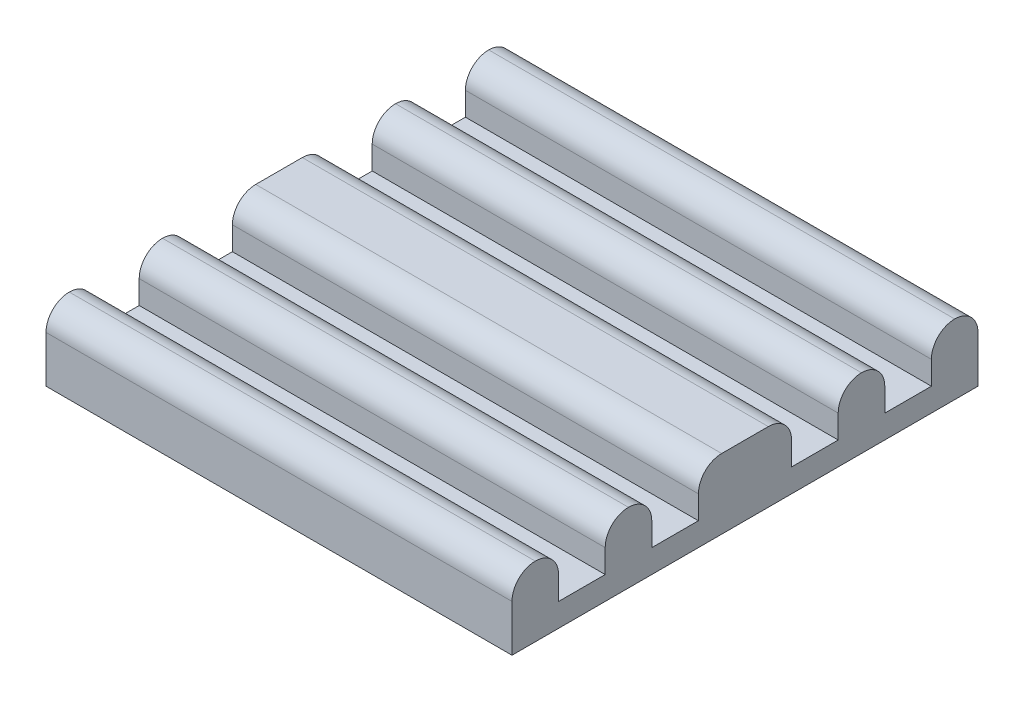
ISO-10303-21;
HEADER;
FILE_DESCRIPTION(('STEP AP214'),'2;1');
FILE_NAME('part.step','',(''),(''),'','','');
FILE_SCHEMA(('AUTOMOTIVE_DESIGN { 1 0 10303 214 1 1 1 1 }'));
ENDSEC;
DATA;
#1=APPLICATION_CONTEXT('core data for automotive mechanical design processes');
#2=APPLICATION_PROTOCOL_DEFINITION('international standard','automotive_design',2000,#1);
#3=PRODUCT_CONTEXT('',#1,'mechanical');
#4=PRODUCT('Part','Part','',(#3));
#5=PRODUCT_RELATED_PRODUCT_CATEGORY('part','',(#4));
#6=PRODUCT_DEFINITION_FORMATION('','',#4);
#7=PRODUCT_DEFINITION_CONTEXT('part definition',#1,'design');
#8=PRODUCT_DEFINITION('design','',#6,#7);
#9=PRODUCT_DEFINITION_SHAPE('','',#8);
#10=(LENGTH_UNIT() NAMED_UNIT(*) SI_UNIT(.MILLI.,.METRE.));
#11=(NAMED_UNIT(*) PLANE_ANGLE_UNIT() SI_UNIT($,.RADIAN.));
#12=(NAMED_UNIT(*) SI_UNIT($,.STERADIAN.) SOLID_ANGLE_UNIT());
#13=UNCERTAINTY_MEASURE_WITH_UNIT(LENGTH_MEASURE(1.E-05),#10,'distance_accuracy_value','');
#14=(GEOMETRIC_REPRESENTATION_CONTEXT(3) GLOBAL_UNCERTAINTY_ASSIGNED_CONTEXT((#13)) GLOBAL_UNIT_ASSIGNED_CONTEXT((#10,
#11,#12)) REPRESENTATION_CONTEXT('',''));
#15=CARTESIAN_POINT('',(0.,0.,0.));
#16=DIRECTION('',(0.,0.,1.));
#17=DIRECTION('',(1.,0.,0.));
#18=AXIS2_PLACEMENT_3D('',#15,#16,#17);
#19=CARTESIAN_POINT('',(10.,3.,-10.));
#20=DIRECTION('',(-1.,0.,0.));
#21=DIRECTION('',(0.,0.,1.));
#22=AXIS2_PLACEMENT_3D('',#19,#20,#21);
#23=PLANE('',#22);
#24=CARTESIAN_POINT('',(10.,2.,9.));
#25=DIRECTION('',(-1.,0.,0.));
#26=DIRECTION('',(0.,0.,1.));
#27=AXIS2_PLACEMENT_3D('',#24,#25,#26);
#28=CIRCLE('',#27,1.);
#29=CARTESIAN_POINT('',(10.,2.,8.));
#30=VERTEX_POINT('',#29);
#31=CARTESIAN_POINT('',(10.,3.,9.));
#32=VERTEX_POINT('',#31);
#33=EDGE_CURVE('E413',#30,#32,#28,.F.);
#34=ORIENTED_EDGE('',*,*,#33,.T.);
#35=CARTESIAN_POINT('',(10.,2.,9.));
#36=DIRECTION('',(-1.,0.,0.));
#37=DIRECTION('',(0.,0.,1.));
#38=AXIS2_PLACEMENT_3D('',#35,#36,#37);
#39=CIRCLE('',#38,1.);
#40=CARTESIAN_POINT('',(10.,2.,10.));
#41=VERTEX_POINT('',#40);
#42=EDGE_CURVE('E416',#32,#41,#39,.F.);
#43=ORIENTED_EDGE('',*,*,#42,.T.);
#44=DIRECTION('',(0.,-1.,0.));
#45=VECTOR('',#44,1.);
#46=CARTESIAN_POINT('',(10.,3.,10.));
#47=LINE('',#46,#45);
#48=CARTESIAN_POINT('',(10.,0.,10.));
#49=VERTEX_POINT('',#48);
#50=EDGE_CURVE('E363',#41,#49,#47,.T.);
#51=ORIENTED_EDGE('',*,*,#50,.T.);
#52=DIRECTION('',(0.,0.,-1.));
#53=VECTOR('',#52,1.);
#54=CARTESIAN_POINT('',(10.,0.,-10.));
#55=LINE('',#54,#53);
#56=CARTESIAN_POINT('',(10.,0.,-10.));
#57=VERTEX_POINT('',#56);
#58=EDGE_CURVE('E254',#49,#57,#55,.T.);
#59=ORIENTED_EDGE('',*,*,#58,.T.);
#60=DIRECTION('',(0.,-1.,0.));
#61=VECTOR('',#60,1.);
#62=CARTESIAN_POINT('',(10.,3.,-10.));
#63=LINE('',#62,#61);
#64=CARTESIAN_POINT('',(10.,2.,-10.));
#65=VERTEX_POINT('',#64);
#66=EDGE_CURVE('E386',#65,#57,#63,.T.);
#67=ORIENTED_EDGE('',*,*,#66,.F.);
#68=CARTESIAN_POINT('',(10.,2.,-9.));
#69=DIRECTION('',(-1.,0.,0.));
#70=DIRECTION('',(0.,0.,1.));
#71=AXIS2_PLACEMENT_3D('',#68,#69,#70);
#72=CIRCLE('',#71,1.);
#73=CARTESIAN_POINT('',(10.,3.,-9.));
#74=VERTEX_POINT('',#73);
#75=EDGE_CURVE('E389',#65,#74,#72,.F.);
#76=ORIENTED_EDGE('',*,*,#75,.T.);
#77=CARTESIAN_POINT('',(10.,2.,-9.));
#78=DIRECTION('',(-1.,0.,0.));
#79=DIRECTION('',(0.,0.,1.));
#80=AXIS2_PLACEMENT_3D('',#77,#78,#79);
#81=CIRCLE('',#80,1.);
#82=CARTESIAN_POINT('',(10.,2.,-8.));
#83=VERTEX_POINT('',#82);
#84=EDGE_CURVE('E392',#74,#83,#81,.F.);
#85=ORIENTED_EDGE('',*,*,#84,.T.);
#86=DIRECTION('',(0.,1.,0.));
#87=VECTOR('',#86,1.);
#88=CARTESIAN_POINT('',(10.,1.,-8.));
#89=LINE('',#88,#87);
#90=CARTESIAN_POINT('',(10.,1.,-8.));
#91=VERTEX_POINT('',#90);
#92=EDGE_CURVE('E298',#91,#83,#89,.T.);
#93=ORIENTED_EDGE('',*,*,#92,.F.);
#94=DIRECTION('',(0.,0.,-1.));
#95=VECTOR('',#94,1.);
#96=CARTESIAN_POINT('',(10.,1.,0.));
#97=LINE('',#96,#95);
#98=CARTESIAN_POINT('',(10.,1.,-6.));
#99=VERTEX_POINT('',#98);
#100=EDGE_CURVE('E335',#99,#91,#97,.T.);
#101=ORIENTED_EDGE('',*,*,#100,.F.);
#102=DIRECTION('',(0.,1.,0.));
#103=VECTOR('',#102,1.);
#104=CARTESIAN_POINT('',(10.,1.,-6.));
#105=LINE('',#104,#103);
#106=CARTESIAN_POINT('',(10.,2.,-6.));
#107=VERTEX_POINT('',#106);
#108=EDGE_CURVE('E343',#99,#107,#105,.T.);
#109=ORIENTED_EDGE('',*,*,#108,.T.);
#110=CARTESIAN_POINT('',(10.,2.,-5.));
#111=DIRECTION('',(-1.,0.,0.));
#112=DIRECTION('',(0.,0.,1.));
#113=AXIS2_PLACEMENT_3D('',#110,#111,#112);
#114=CIRCLE('',#113,1.);
#115=CARTESIAN_POINT('',(10.,3.,-5.));
#116=VERTEX_POINT('',#115);
#117=EDGE_CURVE('E395',#107,#116,#114,.F.);
#118=ORIENTED_EDGE('',*,*,#117,.T.);
#119=CARTESIAN_POINT('',(10.,2.,-5.));
#120=DIRECTION('',(-1.,0.,0.));
#121=DIRECTION('',(0.,0.,1.));
#122=AXIS2_PLACEMENT_3D('',#119,#120,#121);
#123=CIRCLE('',#122,1.);
#124=CARTESIAN_POINT('',(10.,2.,-4.));
#125=VERTEX_POINT('',#124);
#126=EDGE_CURVE('E398',#116,#125,#123,.F.);
#127=ORIENTED_EDGE('',*,*,#126,.T.);
#128=DIRECTION('',(0.,1.,0.));
#129=VECTOR('',#128,1.);
#130=CARTESIAN_POINT('',(10.,1.,-4.));
#131=LINE('',#130,#129);
#132=CARTESIAN_POINT('',(10.,1.,-4.));
#133=VERTEX_POINT('',#132);
#134=EDGE_CURVE('E278',#133,#125,#131,.T.);
#135=ORIENTED_EDGE('',*,*,#134,.F.);
#136=DIRECTION('',(0.,0.,-1.));
#137=VECTOR('',#136,1.);
#138=CARTESIAN_POINT('',(10.,1.,0.));
#139=LINE('',#138,#137);
#140=CARTESIAN_POINT('',(10.,1.,-2.));
#141=VERTEX_POINT('',#140);
#142=EDGE_CURVE('E273',#141,#133,#139,.T.);
#143=ORIENTED_EDGE('',*,*,#142,.F.);
#144=DIRECTION('',(0.,1.,0.));
#145=VECTOR('',#144,1.);
#146=CARTESIAN_POINT('',(10.,1.,-2.));
#147=LINE('',#146,#145);
#148=CARTESIAN_POINT('',(10.,2.,-2.));
#149=VERTEX_POINT('',#148);
#150=EDGE_CURVE('E283',#141,#149,#147,.T.);
#151=ORIENTED_EDGE('',*,*,#150,.T.);
#152=CARTESIAN_POINT('',(10.,2.,-1.));
#153=DIRECTION('',(-1.,0.,0.));
#154=DIRECTION('',(0.,0.,1.));
#155=AXIS2_PLACEMENT_3D('',#152,#153,#154);
#156=CIRCLE('',#155,1.);
#157=CARTESIAN_POINT('',(10.,3.,-1.));
#158=VERTEX_POINT('',#157);
#159=EDGE_CURVE('E401',#149,#158,#156,.F.);
#160=ORIENTED_EDGE('',*,*,#159,.T.);
#161=DIRECTION('',(0.,0.,-1.));
#162=VECTOR('',#161,1.);
#163=CARTESIAN_POINT('',(10.,3.,-10.));
#164=LINE('',#163,#162);
#165=CARTESIAN_POINT('',(10.,3.,0.999999999999997));
#166=VERTEX_POINT('',#165);
#167=EDGE_CURVE('E354',#166,#158,#164,.T.);
#168=ORIENTED_EDGE('',*,*,#167,.F.);
#169=CARTESIAN_POINT('',(10.,2.,0.999999999999998));
#170=DIRECTION('',(-1.,0.,0.));
#171=DIRECTION('',(0.,0.,1.));
#172=AXIS2_PLACEMENT_3D('',#169,#170,#171);
#173=CIRCLE('',#172,1.);
#174=CARTESIAN_POINT('',(10.,2.,2.));
#175=VERTEX_POINT('',#174);
#176=EDGE_CURVE('E404',#166,#175,#173,.F.);
#177=ORIENTED_EDGE('',*,*,#176,.T.);
#178=DIRECTION('',(0.,1.,0.));
#179=VECTOR('',#178,1.);
#180=CARTESIAN_POINT('',(10.,1.,2.));
#181=LINE('',#180,#179);
#182=CARTESIAN_POINT('',(10.,1.,2.));
#183=VERTEX_POINT('',#182);
#184=EDGE_CURVE('E240',#183,#175,#181,.T.);
#185=ORIENTED_EDGE('',*,*,#184,.F.);
#186=DIRECTION('',(0.,0.,-1.));
#187=VECTOR('',#186,1.);
#188=CARTESIAN_POINT('',(10.,1.,0.));
#189=LINE('',#188,#187);
#190=CARTESIAN_POINT('',(10.,1.,4.));
#191=VERTEX_POINT('',#190);
#192=EDGE_CURVE('E306',#191,#183,#189,.T.);
#193=ORIENTED_EDGE('',*,*,#192,.F.);
#194=DIRECTION('',(0.,1.,0.));
#195=VECTOR('',#194,1.);
#196=CARTESIAN_POINT('',(10.,1.,4.));
#197=LINE('',#196,#195);
#198=CARTESIAN_POINT('',(10.,2.,4.));
#199=VERTEX_POINT('',#198);
#200=EDGE_CURVE('E314',#191,#199,#197,.T.);
#201=ORIENTED_EDGE('',*,*,#200,.T.);
#202=CARTESIAN_POINT('',(10.,2.,5.));
#203=DIRECTION('',(-1.,0.,0.));
#204=DIRECTION('',(0.,0.,1.));
#205=AXIS2_PLACEMENT_3D('',#202,#203,#204);
#206=CIRCLE('',#205,1.);
#207=CARTESIAN_POINT('',(10.,3.,5.));
#208=VERTEX_POINT('',#207);
#209=EDGE_CURVE('E407',#199,#208,#206,.F.);
#210=ORIENTED_EDGE('',*,*,#209,.T.);
#211=CARTESIAN_POINT('',(10.,2.,5.));
#212=DIRECTION('',(-1.,0.,0.));
#213=DIRECTION('',(0.,0.,1.));
#214=AXIS2_PLACEMENT_3D('',#211,#212,#213);
#215=CIRCLE('',#214,1.);
#216=CARTESIAN_POINT('',(10.,2.,6.));
#217=VERTEX_POINT('',#216);
#218=EDGE_CURVE('E410',#208,#217,#215,.F.);
#219=ORIENTED_EDGE('',*,*,#218,.T.);
#220=DIRECTION('',(0.,1.,0.));
#221=VECTOR('',#220,1.);
#222=CARTESIAN_POINT('',(10.,1.,6.));
#223=LINE('',#222,#221);
#224=CARTESIAN_POINT('',(10.,1.,6.));
#225=VERTEX_POINT('',#224);
#226=EDGE_CURVE('E251',#225,#217,#223,.T.);
#227=ORIENTED_EDGE('',*,*,#226,.F.);
#228=DIRECTION('',(0.,0.,-1.));
#229=VECTOR('',#228,1.);
#230=CARTESIAN_POINT('',(10.,1.,0.));
#231=LINE('',#230,#229);
#232=CARTESIAN_POINT('',(10.,1.,8.));
#233=VERTEX_POINT('',#232);
#234=EDGE_CURVE('E230',#233,#225,#231,.T.);
#235=ORIENTED_EDGE('',*,*,#234,.F.);
#236=DIRECTION('',(0.,1.,0.));
#237=VECTOR('',#236,1.);
#238=CARTESIAN_POINT('',(10.,1.,8.));
#239=LINE('',#238,#237);
#240=EDGE_CURVE('E255',#233,#30,#239,.T.);
#241=ORIENTED_EDGE('',*,*,#240,.T.);
#242=EDGE_LOOP('',(#34,#43,#51,#59,#67,#76,#85,#93,#101,#109,#118,#127,#135,#143,#151,#160,#168,
#177,#185,#193,#201,#210,#219,#227,#235,#241));
#243=FACE_BOUND('',#242,.T.);
#244=ADVANCED_FACE('F45',(#243),#23,.F.);
#245=CARTESIAN_POINT('',(-10.,3.,-10.));
#246=DIRECTION('',(1.,0.,0.));
#247=DIRECTION('',(0.,0.,-1.));
#248=AXIS2_PLACEMENT_3D('',#245,#246,#247);
#249=PLANE('',#248);
#250=DIRECTION('',(0.,-1.,0.));
#251=VECTOR('',#250,1.);
#252=CARTESIAN_POINT('',(-10.,3.,10.));
#253=LINE('',#252,#251);
#254=CARTESIAN_POINT('',(-10.,2.,10.));
#255=VERTEX_POINT('',#254);
#256=CARTESIAN_POINT('',(-10.,0.,10.));
#257=VERTEX_POINT('',#256);
#258=EDGE_CURVE('E380',#255,#257,#253,.T.);
#259=ORIENTED_EDGE('',*,*,#258,.F.);
#260=CARTESIAN_POINT('',(-10.,2.,9.));
#261=DIRECTION('',(1.,0.,0.));
#262=DIRECTION('',(0.,0.,-1.));
#263=AXIS2_PLACEMENT_3D('',#260,#261,#262);
#264=CIRCLE('',#263,1.);
#265=CARTESIAN_POINT('',(-10.,3.,9.));
#266=VERTEX_POINT('',#265);
#267=EDGE_CURVE('E68',#255,#266,#264,.F.);
#268=ORIENTED_EDGE('',*,*,#267,.T.);
#269=CARTESIAN_POINT('',(-10.,2.,9.));
#270=DIRECTION('',(1.,0.,0.));
#271=DIRECTION('',(0.,0.,-1.));
#272=AXIS2_PLACEMENT_3D('',#269,#270,#271);
#273=CIRCLE('',#272,1.);
#274=CARTESIAN_POINT('',(-10.,2.,8.));
#275=VERTEX_POINT('',#274);
#276=EDGE_CURVE('E63',#266,#275,#273,.F.);
#277=ORIENTED_EDGE('',*,*,#276,.T.);
#278=DIRECTION('',(0.,1.,0.));
#279=VECTOR('',#278,1.);
#280=CARTESIAN_POINT('',(-10.,1.,8.));
#281=LINE('',#280,#279);
#282=CARTESIAN_POINT('',(-10.,1.,8.));
#283=VERTEX_POINT('',#282);
#284=EDGE_CURVE('E229',#283,#275,#281,.T.);
#285=ORIENTED_EDGE('',*,*,#284,.F.);
#286=DIRECTION('',(0.,0.,1.));
#287=VECTOR('',#286,1.);
#288=CARTESIAN_POINT('',(-10.,1.,0.));
#289=LINE('',#288,#287);
#290=CARTESIAN_POINT('',(-10.,1.,6.));
#291=VERTEX_POINT('',#290);
#292=EDGE_CURVE('E236',#291,#283,#289,.T.);
#293=ORIENTED_EDGE('',*,*,#292,.F.);
#294=DIRECTION('',(0.,1.,0.));
#295=VECTOR('',#294,1.);
#296=CARTESIAN_POINT('',(-10.,1.,6.));
#297=LINE('',#296,#295);
#298=CARTESIAN_POINT('',(-10.,2.,6.));
#299=VERTEX_POINT('',#298);
#300=EDGE_CURVE('E219',#291,#299,#297,.T.);
#301=ORIENTED_EDGE('',*,*,#300,.T.);
#302=CARTESIAN_POINT('',(-10.,2.,5.));
#303=DIRECTION('',(1.,0.,0.));
#304=DIRECTION('',(0.,0.,-1.));
#305=AXIS2_PLACEMENT_3D('',#302,#303,#304);
#306=CIRCLE('',#305,1.);
#307=CARTESIAN_POINT('',(-10.,3.,5.));
#308=VERTEX_POINT('',#307);
#309=EDGE_CURVE('E444',#299,#308,#306,.F.);
#310=ORIENTED_EDGE('',*,*,#309,.T.);
#311=CARTESIAN_POINT('',(-10.,2.,5.));
#312=DIRECTION('',(1.,0.,0.));
#313=DIRECTION('',(0.,0.,-1.));
#314=AXIS2_PLACEMENT_3D('',#311,#312,#313);
#315=CIRCLE('',#314,1.);
#316=CARTESIAN_POINT('',(-10.,2.,4.));
#317=VERTEX_POINT('',#316);
#318=EDGE_CURVE('E441',#308,#317,#315,.F.);
#319=ORIENTED_EDGE('',*,*,#318,.T.);
#320=DIRECTION('',(0.,1.,0.));
#321=VECTOR('',#320,1.);
#322=CARTESIAN_POINT('',(-10.,1.,4.));
#323=LINE('',#322,#321);
#324=CARTESIAN_POINT('',(-10.,1.,4.));
#325=VERTEX_POINT('',#324);
#326=EDGE_CURVE('E318',#325,#317,#323,.T.);
#327=ORIENTED_EDGE('',*,*,#326,.F.);
#328=DIRECTION('',(0.,0.,1.));
#329=VECTOR('',#328,1.);
#330=CARTESIAN_POINT('',(-10.,1.,0.));
#331=LINE('',#330,#329);
#332=CARTESIAN_POINT('',(-10.,1.,2.));
#333=VERTEX_POINT('',#332);
#334=EDGE_CURVE('E297',#333,#325,#331,.T.);
#335=ORIENTED_EDGE('',*,*,#334,.F.);
#336=DIRECTION('',(0.,1.,0.));
#337=VECTOR('',#336,1.);
#338=CARTESIAN_POINT('',(-10.,1.,2.));
#339=LINE('',#338,#337);
#340=CARTESIAN_POINT('',(-10.,2.,2.));
#341=VERTEX_POINT('',#340);
#342=EDGE_CURVE('E310',#333,#341,#339,.T.);
#343=ORIENTED_EDGE('',*,*,#342,.T.);
#344=CARTESIAN_POINT('',(-10.,2.,0.999999999999998));
#345=DIRECTION('',(1.,0.,0.));
#346=DIRECTION('',(0.,0.,-1.));
#347=AXIS2_PLACEMENT_3D('',#344,#345,#346);
#348=CIRCLE('',#347,1.);
#349=CARTESIAN_POINT('',(-10.,3.,0.999999999999997));
#350=VERTEX_POINT('',#349);
#351=EDGE_CURVE('E438',#341,#350,#348,.F.);
#352=ORIENTED_EDGE('',*,*,#351,.T.);
#353=DIRECTION('',(0.,0.,1.));
#354=VECTOR('',#353,1.);
#355=CARTESIAN_POINT('',(-10.,3.,-10.));
#356=LINE('',#355,#354);
#357=CARTESIAN_POINT('',(-10.,3.,-1.));
#358=VERTEX_POINT('',#357);
#359=EDGE_CURVE('E358',#358,#350,#356,.T.);
#360=ORIENTED_EDGE('',*,*,#359,.F.);
#361=CARTESIAN_POINT('',(-10.,2.,-1.));
#362=DIRECTION('',(1.,0.,0.));
#363=DIRECTION('',(0.,0.,-1.));
#364=AXIS2_PLACEMENT_3D('',#361,#362,#363);
#365=CIRCLE('',#364,1.);
#366=CARTESIAN_POINT('',(-10.,2.,-2.));
#367=VERTEX_POINT('',#366);
#368=EDGE_CURVE('E435',#358,#367,#365,.F.);
#369=ORIENTED_EDGE('',*,*,#368,.T.);
#370=DIRECTION('',(0.,1.,0.));
#371=VECTOR('',#370,1.);
#372=CARTESIAN_POINT('',(-10.,1.,-2.));
#373=LINE('',#372,#371);
#374=CARTESIAN_POINT('',(-10.,1.,-2.));
#375=VERTEX_POINT('',#374);
#376=EDGE_CURVE('E287',#375,#367,#373,.T.);
#377=ORIENTED_EDGE('',*,*,#376,.F.);
#378=DIRECTION('',(0.,0.,1.));
#379=VECTOR('',#378,1.);
#380=CARTESIAN_POINT('',(-10.,1.,0.));
#381=LINE('',#380,#379);
#382=CARTESIAN_POINT('',(-10.,1.,-4.));
#383=VERTEX_POINT('',#382);
#384=EDGE_CURVE('E264',#383,#375,#381,.T.);
#385=ORIENTED_EDGE('',*,*,#384,.F.);
#386=DIRECTION('',(0.,1.,0.));
#387=VECTOR('',#386,1.);
#388=CARTESIAN_POINT('',(-10.,1.,-4.));
#389=LINE('',#388,#387);
#390=CARTESIAN_POINT('',(-10.,2.,-4.));
#391=VERTEX_POINT('',#390);
#392=EDGE_CURVE('E277',#383,#391,#389,.T.);
#393=ORIENTED_EDGE('',*,*,#392,.T.);
#394=CARTESIAN_POINT('',(-10.,2.,-5.));
#395=DIRECTION('',(1.,0.,0.));
#396=DIRECTION('',(0.,0.,-1.));
#397=AXIS2_PLACEMENT_3D('',#394,#395,#396);
#398=CIRCLE('',#397,1.);
#399=CARTESIAN_POINT('',(-10.,3.,-5.));
#400=VERTEX_POINT('',#399);
#401=EDGE_CURVE('E432',#391,#400,#398,.F.);
#402=ORIENTED_EDGE('',*,*,#401,.T.);
#403=CARTESIAN_POINT('',(-10.,2.,-5.));
#404=DIRECTION('',(1.,0.,0.));
#405=DIRECTION('',(0.,0.,-1.));
#406=AXIS2_PLACEMENT_3D('',#403,#404,#405);
#407=CIRCLE('',#406,1.);
#408=CARTESIAN_POINT('',(-10.,2.,-6.));
#409=VERTEX_POINT('',#408);
#410=EDGE_CURVE('E429',#400,#409,#407,.F.);
#411=ORIENTED_EDGE('',*,*,#410,.T.);
#412=DIRECTION('',(0.,1.,0.));
#413=VECTOR('',#412,1.);
#414=CARTESIAN_POINT('',(-10.,1.,-6.));
#415=LINE('',#414,#413);
#416=CARTESIAN_POINT('',(-10.,1.,-6.));
#417=VERTEX_POINT('',#416);
#418=EDGE_CURVE('E347',#417,#409,#415,.T.);
#419=ORIENTED_EDGE('',*,*,#418,.F.);
#420=DIRECTION('',(0.,0.,1.));
#421=VECTOR('',#420,1.);
#422=CARTESIAN_POINT('',(-10.,1.,0.));
#423=LINE('',#422,#421);
#424=CARTESIAN_POINT('',(-10.,1.,-8.));
#425=VERTEX_POINT('',#424);
#426=EDGE_CURVE('E327',#425,#417,#423,.T.);
#427=ORIENTED_EDGE('',*,*,#426,.F.);
#428=DIRECTION('',(0.,1.,0.));
#429=VECTOR('',#428,1.);
#430=CARTESIAN_POINT('',(-10.,1.,-8.));
#431=LINE('',#430,#429);
#432=CARTESIAN_POINT('',(-10.,2.,-8.));
#433=VERTEX_POINT('',#432);
#434=EDGE_CURVE('E339',#425,#433,#431,.T.);
#435=ORIENTED_EDGE('',*,*,#434,.T.);
#436=CARTESIAN_POINT('',(-10.,2.,-9.));
#437=DIRECTION('',(1.,0.,0.));
#438=DIRECTION('',(0.,0.,-1.));
#439=AXIS2_PLACEMENT_3D('',#436,#437,#438);
#440=CIRCLE('',#439,1.);
#441=CARTESIAN_POINT('',(-10.,3.,-9.));
#442=VERTEX_POINT('',#441);
#443=EDGE_CURVE('E426',#433,#442,#440,.F.);
#444=ORIENTED_EDGE('',*,*,#443,.T.);
#445=CARTESIAN_POINT('',(-10.,2.,-9.));
#446=DIRECTION('',(1.,0.,0.));
#447=DIRECTION('',(0.,0.,-1.));
#448=AXIS2_PLACEMENT_3D('',#445,#446,#447);
#449=CIRCLE('',#448,1.);
#450=CARTESIAN_POINT('',(-10.,2.,-10.));
#451=VERTEX_POINT('',#450);
#452=EDGE_CURVE('E423',#442,#451,#449,.F.);
#453=ORIENTED_EDGE('',*,*,#452,.T.);
#454=DIRECTION('',(0.,-1.,0.));
#455=VECTOR('',#454,1.);
#456=CARTESIAN_POINT('',(-10.,3.,-10.));
#457=LINE('',#456,#455);
#458=CARTESIAN_POINT('',(-10.,0.,-10.));
#459=VERTEX_POINT('',#458);
#460=EDGE_CURVE('E383',#451,#459,#457,.T.);
#461=ORIENTED_EDGE('',*,*,#460,.T.);
#462=DIRECTION('',(0.,0.,1.));
#463=VECTOR('',#462,1.);
#464=CARTESIAN_POINT('',(-10.,0.,-10.));
#465=LINE('',#464,#463);
#466=EDGE_CURVE('E371',#459,#257,#465,.T.);
#467=ORIENTED_EDGE('',*,*,#466,.T.);
#468=EDGE_LOOP('',(#259,#268,#277,#285,#293,#301,#310,#319,#327,#335,#343,#352,#360,#369,#377,
#385,#393,#402,#411,#419,#427,#435,#444,#453,#461,#467));
#469=FACE_BOUND('',#468,.T.);
#470=ADVANCED_FACE('F242',(#469),#249,.F.);
#471=CARTESIAN_POINT('',(0.,3.,0.));
#472=DIRECTION('',(0.,1.,0.));
#473=DIRECTION('',(0.,0.,1.));
#474=AXIS2_PLACEMENT_3D('',#471,#472,#473);
#475=PLANE('',#474);
#476=ORIENTED_EDGE('',*,*,#359,.T.);
#477=DIRECTION('',(1.,0.,0.));
#478=VECTOR('',#477,1.);
#479=CARTESIAN_POINT('',(0.,3.,0.999999999999998));
#480=LINE('',#479,#478);
#481=EDGE_CURVE('E462',#350,#166,#480,.T.);
#482=ORIENTED_EDGE('',*,*,#481,.T.);
#483=ORIENTED_EDGE('',*,*,#167,.T.);
#484=DIRECTION('',(1.,0.,0.));
#485=VECTOR('',#484,1.);
#486=CARTESIAN_POINT('',(-10.,3.,-1.));
#487=LINE('',#486,#485);
#488=EDGE_CURVE('E459',#158,#358,#487,.F.);
#489=ORIENTED_EDGE('',*,*,#488,.T.);
#490=EDGE_LOOP('',(#476,#482,#483,#489));
#491=FACE_BOUND('',#490,.T.);
#492=ADVANCED_FACE('F558',(#491),#475,.T.);
#493=CARTESIAN_POINT('',(-10.,3.,-10.));
#494=DIRECTION('',(0.,0.,1.));
#495=DIRECTION('',(1.,0.,0.));
#496=AXIS2_PLACEMENT_3D('',#493,#494,#495);
#497=PLANE('',#496);
#498=ORIENTED_EDGE('',*,*,#460,.F.);
#499=DIRECTION('',(-1.,0.,0.));
#500=VECTOR('',#499,1.);
#501=CARTESIAN_POINT('',(10.,2.,-10.));
#502=LINE('',#501,#500);
#503=EDGE_CURVE('E11',#451,#65,#502,.F.);
#504=ORIENTED_EDGE('',*,*,#503,.T.);
#505=ORIENTED_EDGE('',*,*,#66,.T.);
#506=DIRECTION('',(-1.,0.,0.));
#507=VECTOR('',#506,1.);
#508=CARTESIAN_POINT('',(-10.,0.,-10.));
#509=LINE('',#508,#507);
#510=EDGE_CURVE('E367',#57,#459,#509,.T.);
#511=ORIENTED_EDGE('',*,*,#510,.T.);
#512=EDGE_LOOP('',(#498,#504,#505,#511));
#513=FACE_BOUND('',#512,.T.);
#514=ADVANCED_FACE('F508',(#513),#497,.F.);
#515=CARTESIAN_POINT('',(-10.,3.,10.));
#516=DIRECTION('',(0.,0.,-1.));
#517=DIRECTION('',(-1.,0.,0.));
#518=AXIS2_PLACEMENT_3D('',#515,#516,#517);
#519=PLANE('',#518);
#520=ORIENTED_EDGE('',*,*,#50,.F.);
#521=DIRECTION('',(1.,0.,0.));
#522=VECTOR('',#521,1.);
#523=CARTESIAN_POINT('',(-10.,2.,10.));
#524=LINE('',#523,#522);
#525=EDGE_CURVE('E419',#41,#255,#524,.F.);
#526=ORIENTED_EDGE('',*,*,#525,.T.);
#527=ORIENTED_EDGE('',*,*,#258,.T.);
#528=DIRECTION('',(1.,0.,0.));
#529=VECTOR('',#528,1.);
#530=CARTESIAN_POINT('',(-10.,0.,10.));
#531=LINE('',#530,#529);
#532=EDGE_CURVE('E359',#257,#49,#531,.T.);
#533=ORIENTED_EDGE('',*,*,#532,.T.);
#534=EDGE_LOOP('',(#520,#526,#527,#533));
#535=FACE_BOUND('',#534,.T.);
#536=ADVANCED_FACE('F518',(#535),#519,.F.);
#537=CARTESIAN_POINT('',(0.,0.,0.));
#538=DIRECTION('',(0.,1.,0.));
#539=DIRECTION('',(0.,0.,1.));
#540=AXIS2_PLACEMENT_3D('',#537,#538,#539);
#541=PLANE('',#540);
#542=ORIENTED_EDGE('',*,*,#58,.F.);
#543=ORIENTED_EDGE('',*,*,#532,.F.);
#544=ORIENTED_EDGE('',*,*,#466,.F.);
#545=ORIENTED_EDGE('',*,*,#510,.F.);
#546=EDGE_LOOP('',(#542,#543,#544,#545));
#547=FACE_BOUND('',#546,.T.);
#548=ADVANCED_FACE('F515',(#547),#541,.F.);
#549=CARTESIAN_POINT('',(0.,1.,2.));
#550=DIRECTION('',(0.,0.,1.));
#551=DIRECTION('',(1.,0.,0.));
#552=AXIS2_PLACEMENT_3D('',#549,#550,#551);
#553=PLANE('',#552);
#554=ORIENTED_EDGE('',*,*,#184,.T.);
#555=DIRECTION('',(1.,0.,0.));
#556=VECTOR('',#555,1.);
#557=CARTESIAN_POINT('',(0.,2.,2.));
#558=LINE('',#557,#556);
#559=EDGE_CURVE('E466',#175,#341,#558,.F.);
#560=ORIENTED_EDGE('',*,*,#559,.T.);
#561=ORIENTED_EDGE('',*,*,#342,.F.);
#562=DIRECTION('',(1.,0.,0.));
#563=VECTOR('',#562,1.);
#564=CARTESIAN_POINT('',(0.,1.,2.));
#565=LINE('',#564,#563);
#566=EDGE_CURVE('E294',#333,#183,#565,.T.);
#567=ORIENTED_EDGE('',*,*,#566,.T.);
#568=EDGE_LOOP('',(#554,#560,#561,#567));
#569=FACE_BOUND('',#568,.T.);
#570=ADVANCED_FACE('F758',(#569),#553,.T.);
#571=CARTESIAN_POINT('',(0.,1.,4.));
#572=DIRECTION('',(0.,0.,1.));
#573=DIRECTION('',(1.,0.,0.));
#574=AXIS2_PLACEMENT_3D('',#571,#572,#573);
#575=PLANE('',#574);
#576=ORIENTED_EDGE('',*,*,#326,.T.);
#577=DIRECTION('',(1.,0.,0.));
#578=VECTOR('',#577,1.);
#579=CARTESIAN_POINT('',(10.,2.,4.));
#580=LINE('',#579,#578);
#581=EDGE_CURVE('E456',#317,#199,#580,.T.);
#582=ORIENTED_EDGE('',*,*,#581,.T.);
#583=ORIENTED_EDGE('',*,*,#200,.F.);
#584=DIRECTION('',(1.,0.,0.));
#585=VECTOR('',#584,1.);
#586=CARTESIAN_POINT('',(0.,1.,4.));
#587=LINE('',#586,#585);
#588=EDGE_CURVE('E302',#325,#191,#587,.T.);
#589=ORIENTED_EDGE('',*,*,#588,.F.);
#590=EDGE_LOOP('',(#576,#582,#583,#589));
#591=FACE_BOUND('',#590,.T.);
#592=ADVANCED_FACE('F542',(#591),#575,.F.);
#593=CARTESIAN_POINT('',(0.,1.,0.));
#594=DIRECTION('',(0.,1.,0.));
#595=DIRECTION('',(0.,0.,1.));
#596=AXIS2_PLACEMENT_3D('',#593,#594,#595);
#597=PLANE('',#596);
#598=ORIENTED_EDGE('',*,*,#566,.F.);
#599=ORIENTED_EDGE('',*,*,#334,.T.);
#600=ORIENTED_EDGE('',*,*,#588,.T.);
#601=ORIENTED_EDGE('',*,*,#192,.T.);
#602=EDGE_LOOP('',(#598,#599,#600,#601));
#603=FACE_BOUND('',#602,.T.);
#604=ADVANCED_FACE('F547',(#603),#597,.T.);
#605=CARTESIAN_POINT('',(0.,1.,-8.));
#606=DIRECTION('',(0.,0.,1.));
#607=DIRECTION('',(1.,0.,0.));
#608=AXIS2_PLACEMENT_3D('',#605,#606,#607);
#609=PLANE('',#608);
#610=ORIENTED_EDGE('',*,*,#92,.T.);
#611=DIRECTION('',(1.,0.,0.));
#612=VECTOR('',#611,1.);
#613=CARTESIAN_POINT('',(0.,2.,-8.));
#614=LINE('',#613,#612);
#615=EDGE_CURVE('E55',#83,#433,#614,.F.);
#616=ORIENTED_EDGE('',*,*,#615,.T.);
#617=ORIENTED_EDGE('',*,*,#434,.F.);
#618=DIRECTION('',(1.,0.,0.));
#619=VECTOR('',#618,1.);
#620=CARTESIAN_POINT('',(0.,1.,-8.));
#621=LINE('',#620,#619);
#622=EDGE_CURVE('E282',#425,#91,#621,.T.);
#623=ORIENTED_EDGE('',*,*,#622,.T.);
#624=EDGE_LOOP('',(#610,#616,#617,#623));
#625=FACE_BOUND('',#624,.T.);
#626=ADVANCED_FACE('F592',(#625),#609,.T.);
#627=CARTESIAN_POINT('',(0.,1.,-6.));
#628=DIRECTION('',(0.,0.,1.));
#629=DIRECTION('',(1.,0.,0.));
#630=AXIS2_PLACEMENT_3D('',#627,#628,#629);
#631=PLANE('',#630);
#632=ORIENTED_EDGE('',*,*,#418,.T.);
#633=DIRECTION('',(1.,0.,0.));
#634=VECTOR('',#633,1.);
#635=CARTESIAN_POINT('',(10.,2.,-6.));
#636=LINE('',#635,#634);
#637=EDGE_CURVE('E477',#409,#107,#636,.T.);
#638=ORIENTED_EDGE('',*,*,#637,.T.);
#639=ORIENTED_EDGE('',*,*,#108,.F.);
#640=DIRECTION('',(1.,0.,0.));
#641=VECTOR('',#640,1.);
#642=CARTESIAN_POINT('',(0.,1.,-6.));
#643=LINE('',#642,#641);
#644=EDGE_CURVE('E331',#417,#99,#643,.T.);
#645=ORIENTED_EDGE('',*,*,#644,.F.);
#646=EDGE_LOOP('',(#632,#638,#639,#645));
#647=FACE_BOUND('',#646,.T.);
#648=ADVANCED_FACE('F584',(#647),#631,.F.);
#649=CARTESIAN_POINT('',(0.,1.,0.));
#650=DIRECTION('',(0.,1.,0.));
#651=DIRECTION('',(0.,0.,1.));
#652=AXIS2_PLACEMENT_3D('',#649,#650,#651);
#653=PLANE('',#652);
#654=ORIENTED_EDGE('',*,*,#622,.F.);
#655=ORIENTED_EDGE('',*,*,#426,.T.);
#656=ORIENTED_EDGE('',*,*,#644,.T.);
#657=ORIENTED_EDGE('',*,*,#100,.T.);
#658=EDGE_LOOP('',(#654,#655,#656,#657));
#659=FACE_BOUND('',#658,.T.);
#660=ADVANCED_FACE('F589',(#659),#653,.T.);
#661=CARTESIAN_POINT('',(0.,1.,-4.));
#662=DIRECTION('',(0.,0.,1.));
#663=DIRECTION('',(1.,0.,0.));
#664=AXIS2_PLACEMENT_3D('',#661,#662,#663);
#665=PLANE('',#664);
#666=ORIENTED_EDGE('',*,*,#134,.T.);
#667=DIRECTION('',(1.,0.,0.));
#668=VECTOR('',#667,1.);
#669=CARTESIAN_POINT('',(0.,2.,-4.));
#670=LINE('',#669,#668);
#671=EDGE_CURVE('E473',#125,#391,#670,.F.);
#672=ORIENTED_EDGE('',*,*,#671,.T.);
#673=ORIENTED_EDGE('',*,*,#392,.F.);
#674=DIRECTION('',(1.,0.,0.));
#675=VECTOR('',#674,1.);
#676=CARTESIAN_POINT('',(0.,1.,-4.));
#677=LINE('',#676,#675);
#678=EDGE_CURVE('E261',#383,#133,#677,.T.);
#679=ORIENTED_EDGE('',*,*,#678,.T.);
#680=EDGE_LOOP('',(#666,#672,#673,#679));
#681=FACE_BOUND('',#680,.T.);
#682=ADVANCED_FACE('F574',(#681),#665,.T.);
#683=CARTESIAN_POINT('',(0.,1.,-2.));
#684=DIRECTION('',(0.,0.,1.));
#685=DIRECTION('',(1.,0.,0.));
#686=AXIS2_PLACEMENT_3D('',#683,#684,#685);
#687=PLANE('',#686);
#688=ORIENTED_EDGE('',*,*,#376,.T.);
#689=DIRECTION('',(1.,0.,0.));
#690=VECTOR('',#689,1.);
#691=CARTESIAN_POINT('',(10.,2.,-2.));
#692=LINE('',#691,#690);
#693=EDGE_CURVE('E469',#367,#149,#692,.T.);
#694=ORIENTED_EDGE('',*,*,#693,.T.);
#695=ORIENTED_EDGE('',*,*,#150,.F.);
#696=DIRECTION('',(1.,0.,0.));
#697=VECTOR('',#696,1.);
#698=CARTESIAN_POINT('',(0.,1.,-2.));
#699=LINE('',#698,#697);
#700=EDGE_CURVE('E269',#375,#141,#699,.T.);
#701=ORIENTED_EDGE('',*,*,#700,.F.);
#702=EDGE_LOOP('',(#688,#694,#695,#701));
#703=FACE_BOUND('',#702,.T.);
#704=ADVANCED_FACE('F566',(#703),#687,.F.);
#705=CARTESIAN_POINT('',(0.,1.,0.));
#706=DIRECTION('',(0.,1.,0.));
#707=DIRECTION('',(0.,0.,1.));
#708=AXIS2_PLACEMENT_3D('',#705,#706,#707);
#709=PLANE('',#708);
#710=ORIENTED_EDGE('',*,*,#678,.F.);
#711=ORIENTED_EDGE('',*,*,#384,.T.);
#712=ORIENTED_EDGE('',*,*,#700,.T.);
#713=ORIENTED_EDGE('',*,*,#142,.T.);
#714=EDGE_LOOP('',(#710,#711,#712,#713));
#715=FACE_BOUND('',#714,.T.);
#716=ADVANCED_FACE('F571',(#715),#709,.T.);
#717=CARTESIAN_POINT('',(0.,1.,6.));
#718=DIRECTION('',(0.,0.,1.));
#719=DIRECTION('',(1.,0.,0.));
#720=AXIS2_PLACEMENT_3D('',#717,#718,#719);
#721=PLANE('',#720);
#722=ORIENTED_EDGE('',*,*,#226,.T.);
#723=DIRECTION('',(1.,0.,0.));
#724=VECTOR('',#723,1.);
#725=CARTESIAN_POINT('',(0.,2.,6.));
#726=LINE('',#725,#724);
#727=EDGE_CURVE('E226',#217,#299,#726,.F.);
#728=ORIENTED_EDGE('',*,*,#727,.T.);
#729=ORIENTED_EDGE('',*,*,#300,.F.);
#730=DIRECTION('',(1.,0.,0.));
#731=VECTOR('',#730,1.);
#732=CARTESIAN_POINT('',(0.,1.,6.));
#733=LINE('',#732,#731);
#734=EDGE_CURVE('E223',#291,#225,#733,.T.);
#735=ORIENTED_EDGE('',*,*,#734,.T.);
#736=EDGE_LOOP('',(#722,#728,#729,#735));
#737=FACE_BOUND('',#736,.T.);
#738=ADVANCED_FACE('F222',(#737),#721,.T.);
#739=CARTESIAN_POINT('',(0.,1.,8.));
#740=DIRECTION('',(0.,0.,1.));
#741=DIRECTION('',(1.,0.,0.));
#742=AXIS2_PLACEMENT_3D('',#739,#740,#741);
#743=PLANE('',#742);
#744=ORIENTED_EDGE('',*,*,#284,.T.);
#745=DIRECTION('',(1.,0.,0.));
#746=VECTOR('',#745,1.);
#747=CARTESIAN_POINT('',(10.,2.,8.));
#748=LINE('',#747,#746);
#749=EDGE_CURVE('E451',#275,#30,#748,.T.);
#750=ORIENTED_EDGE('',*,*,#749,.T.);
#751=ORIENTED_EDGE('',*,*,#240,.F.);
#752=DIRECTION('',(1.,0.,0.));
#753=VECTOR('',#752,1.);
#754=CARTESIAN_POINT('',(0.,1.,8.));
#755=LINE('',#754,#753);
#756=EDGE_CURVE('E244',#283,#233,#755,.T.);
#757=ORIENTED_EDGE('',*,*,#756,.F.);
#758=EDGE_LOOP('',(#744,#750,#751,#757));
#759=FACE_BOUND('',#758,.T.);
#760=ADVANCED_FACE('F529',(#759),#743,.F.);
#761=CARTESIAN_POINT('',(0.,1.,0.));
#762=DIRECTION('',(0.,1.,0.));
#763=DIRECTION('',(0.,0.,1.));
#764=AXIS2_PLACEMENT_3D('',#761,#762,#763);
#765=PLANE('',#764);
#766=ORIENTED_EDGE('',*,*,#734,.F.);
#767=ORIENTED_EDGE('',*,*,#292,.T.);
#768=ORIENTED_EDGE('',*,*,#756,.T.);
#769=ORIENTED_EDGE('',*,*,#234,.T.);
#770=EDGE_LOOP('',(#766,#767,#768,#769));
#771=FACE_BOUND('',#770,.T.);
#772=ADVANCED_FACE('F234',(#771),#765,.T.);
#773=CARTESIAN_POINT('',(0.,2.,9.));
#774=DIRECTION('',(-1.,0.,0.));
#775=DIRECTION('',(0.,0.,1.));
#776=AXIS2_PLACEMENT_3D('',#773,#774,#775);
#777=CYLINDRICAL_SURFACE('',#776,1.);
#778=ORIENTED_EDGE('',*,*,#749,.F.);
#779=ORIENTED_EDGE('',*,*,#276,.F.);
#780=DIRECTION('',(1.,0.,0.));
#781=VECTOR('',#780,1.);
#782=CARTESIAN_POINT('',(-10.,3.,9.));
#783=LINE('',#782,#781);
#784=EDGE_CURVE('E265',#32,#266,#783,.F.);
#785=ORIENTED_EDGE('',*,*,#784,.F.);
#786=ORIENTED_EDGE('',*,*,#33,.F.);
#787=EDGE_LOOP('',(#778,#779,#785,#786));
#788=FACE_BOUND('',#787,.T.);
#789=ADVANCED_FACE('F527',(#788),#777,.T.);
#790=CARTESIAN_POINT('',(0.,2.,9.));
#791=DIRECTION('',(-1.,0.,0.));
#792=DIRECTION('',(0.,0.,1.));
#793=AXIS2_PLACEMENT_3D('',#790,#791,#792);
#794=CYLINDRICAL_SURFACE('',#793,1.);
#795=ORIENTED_EDGE('',*,*,#267,.F.);
#796=ORIENTED_EDGE('',*,*,#525,.F.);
#797=ORIENTED_EDGE('',*,*,#42,.F.);
#798=ORIENTED_EDGE('',*,*,#784,.T.);
#799=EDGE_LOOP('',(#795,#796,#797,#798));
#800=FACE_BOUND('',#799,.T.);
#801=ADVANCED_FACE('F522',(#800),#794,.T.);
#802=CARTESIAN_POINT('',(0.,2.,5.));
#803=DIRECTION('',(-1.,0.,0.));
#804=DIRECTION('',(0.,0.,1.));
#805=AXIS2_PLACEMENT_3D('',#802,#803,#804);
#806=CYLINDRICAL_SURFACE('',#805,1.);
#807=ORIENTED_EDGE('',*,*,#581,.F.);
#808=ORIENTED_EDGE('',*,*,#318,.F.);
#809=DIRECTION('',(1.,0.,0.));
#810=VECTOR('',#809,1.);
#811=CARTESIAN_POINT('',(-10.,3.,5.));
#812=LINE('',#811,#810);
#813=EDGE_CURVE('E486',#208,#308,#812,.F.);
#814=ORIENTED_EDGE('',*,*,#813,.F.);
#815=ORIENTED_EDGE('',*,*,#209,.F.);
#816=EDGE_LOOP('',(#807,#808,#814,#815));
#817=FACE_BOUND('',#816,.T.);
#818=ADVANCED_FACE('F539',(#817),#806,.T.);
#819=CARTESIAN_POINT('',(0.,2.,5.));
#820=DIRECTION('',(1.,0.,0.));
#821=DIRECTION('',(0.,0.,-1.));
#822=AXIS2_PLACEMENT_3D('',#819,#820,#821);
#823=CYLINDRICAL_SURFACE('',#822,1.);
#824=ORIENTED_EDGE('',*,*,#309,.F.);
#825=ORIENTED_EDGE('',*,*,#727,.F.);
#826=ORIENTED_EDGE('',*,*,#218,.F.);
#827=ORIENTED_EDGE('',*,*,#813,.T.);
#828=EDGE_LOOP('',(#824,#825,#826,#827));
#829=FACE_BOUND('',#828,.T.);
#830=ADVANCED_FACE('F533',(#829),#823,.T.);
#831=CARTESIAN_POINT('',(0.,2.,0.999999999999998));
#832=DIRECTION('',(1.,0.,0.));
#833=DIRECTION('',(0.,0.,-1.));
#834=AXIS2_PLACEMENT_3D('',#831,#832,#833);
#835=CYLINDRICAL_SURFACE('',#834,1.);
#836=ORIENTED_EDGE('',*,*,#351,.F.);
#837=ORIENTED_EDGE('',*,*,#559,.F.);
#838=ORIENTED_EDGE('',*,*,#176,.F.);
#839=ORIENTED_EDGE('',*,*,#481,.F.);
#840=EDGE_LOOP('',(#836,#837,#838,#839));
#841=FACE_BOUND('',#840,.T.);
#842=ADVANCED_FACE('F555',(#841),#835,.T.);
#843=CARTESIAN_POINT('',(0.,2.,-1.));
#844=DIRECTION('',(-1.,0.,0.));
#845=DIRECTION('',(0.,0.,1.));
#846=AXIS2_PLACEMENT_3D('',#843,#844,#845);
#847=CYLINDRICAL_SURFACE('',#846,1.);
#848=ORIENTED_EDGE('',*,*,#368,.F.);
#849=ORIENTED_EDGE('',*,*,#488,.F.);
#850=ORIENTED_EDGE('',*,*,#159,.F.);
#851=ORIENTED_EDGE('',*,*,#693,.F.);
#852=EDGE_LOOP('',(#848,#849,#850,#851));
#853=FACE_BOUND('',#852,.T.);
#854=ADVANCED_FACE('F564',(#853),#847,.T.);
#855=CARTESIAN_POINT('',(0.,2.,-5.));
#856=DIRECTION('',(-1.,0.,0.));
#857=DIRECTION('',(0.,0.,1.));
#858=AXIS2_PLACEMENT_3D('',#855,#856,#857);
#859=CYLINDRICAL_SURFACE('',#858,1.);
#860=ORIENTED_EDGE('',*,*,#637,.F.);
#861=ORIENTED_EDGE('',*,*,#410,.F.);
#862=DIRECTION('',(1.,0.,0.));
#863=VECTOR('',#862,1.);
#864=CARTESIAN_POINT('',(-10.,3.,-5.));
#865=LINE('',#864,#863);
#866=EDGE_CURVE('E489',#116,#400,#865,.F.);
#867=ORIENTED_EDGE('',*,*,#866,.F.);
#868=ORIENTED_EDGE('',*,*,#117,.F.);
#869=EDGE_LOOP('',(#860,#861,#867,#868));
#870=FACE_BOUND('',#869,.T.);
#871=ADVANCED_FACE('F581',(#870),#859,.T.);
#872=CARTESIAN_POINT('',(0.,2.,-5.));
#873=DIRECTION('',(1.,0.,0.));
#874=DIRECTION('',(0.,0.,-1.));
#875=AXIS2_PLACEMENT_3D('',#872,#873,#874);
#876=CYLINDRICAL_SURFACE('',#875,1.);
#877=ORIENTED_EDGE('',*,*,#401,.F.);
#878=ORIENTED_EDGE('',*,*,#671,.F.);
#879=ORIENTED_EDGE('',*,*,#126,.F.);
#880=ORIENTED_EDGE('',*,*,#866,.T.);
#881=EDGE_LOOP('',(#877,#878,#879,#880));
#882=FACE_BOUND('',#881,.T.);
#883=ADVANCED_FACE('F576',(#882),#876,.T.);
#884=CARTESIAN_POINT('',(0.,2.,-9.));
#885=DIRECTION('',(1.,0.,0.));
#886=DIRECTION('',(0.,0.,-1.));
#887=AXIS2_PLACEMENT_3D('',#884,#885,#886);
#888=CYLINDRICAL_SURFACE('',#887,1.);
#889=ORIENTED_EDGE('',*,*,#503,.F.);
#890=ORIENTED_EDGE('',*,*,#452,.F.);
#891=DIRECTION('',(-1.,0.,0.));
#892=VECTOR('',#891,1.);
#893=CARTESIAN_POINT('',(-10.,3.,-9.));
#894=LINE('',#893,#892);
#895=EDGE_CURVE('E49',#74,#442,#894,.T.);
#896=ORIENTED_EDGE('',*,*,#895,.F.);
#897=ORIENTED_EDGE('',*,*,#75,.F.);
#898=EDGE_LOOP('',(#889,#890,#896,#897));
#899=FACE_BOUND('',#898,.T.);
#900=ADVANCED_FACE('F47',(#899),#888,.T.);
#901=CARTESIAN_POINT('',(0.,2.,-9.));
#902=DIRECTION('',(1.,0.,0.));
#903=DIRECTION('',(0.,0.,-1.));
#904=AXIS2_PLACEMENT_3D('',#901,#902,#903);
#905=CYLINDRICAL_SURFACE('',#904,1.);
#906=ORIENTED_EDGE('',*,*,#443,.F.);
#907=ORIENTED_EDGE('',*,*,#615,.F.);
#908=ORIENTED_EDGE('',*,*,#84,.F.);
#909=ORIENTED_EDGE('',*,*,#895,.T.);
#910=EDGE_LOOP('',(#906,#907,#908,#909));
#911=FACE_BOUND('',#910,.T.);
#912=ADVANCED_FACE('F500',(#911),#905,.T.);
#913=CLOSED_SHELL('',(#244,#470,#492,#514,#536,#548,#570,#592,#604,#626,#648,#660,#682,#704,
#716,#738,#760,#772,#789,#801,#818,#830,#842,#854,#871,#883,#900,#912));
#914=MANIFOLD_SOLID_BREP('B2',#913);
#915=ADVANCED_BREP_SHAPE_REPRESENTATION('',(#18,#914),#14);
#916=SHAPE_DEFINITION_REPRESENTATION(#9,#915);
ENDSEC;
END-ISO-10303-21;
